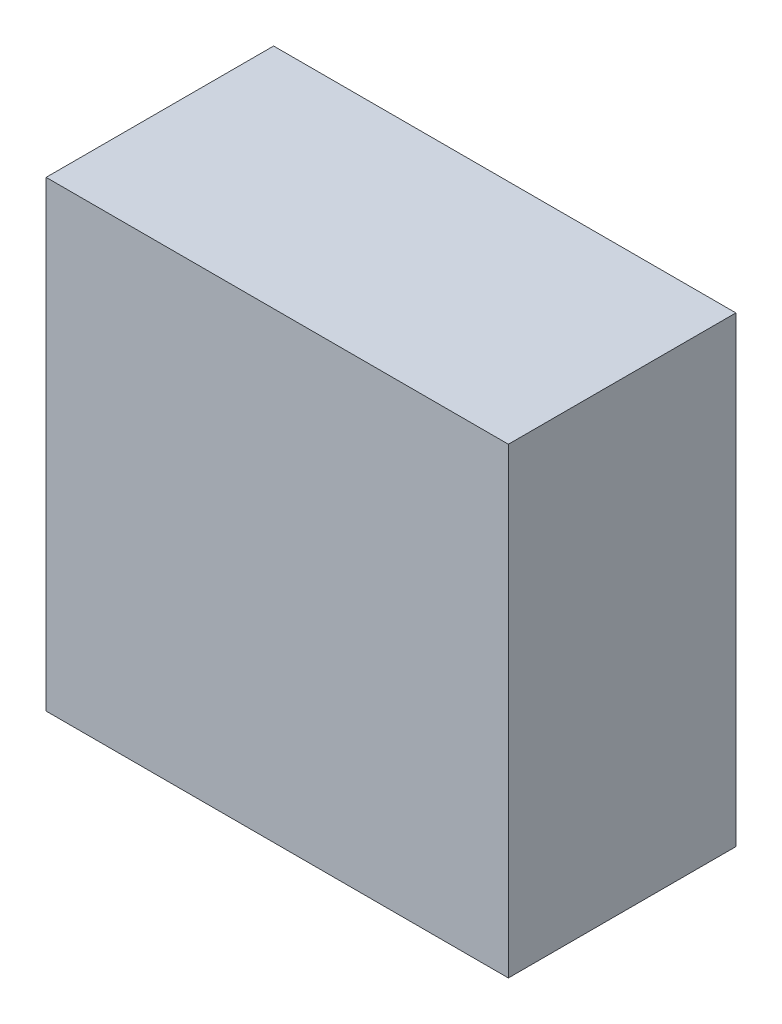
ISO-10303-21;
HEADER;
FILE_DESCRIPTION(('STEP AP214'),'2;1');
FILE_NAME('part.step','',(''),(''),'','','');
FILE_SCHEMA(('AUTOMOTIVE_DESIGN { 1 0 10303 214 1 1 1 1 }'));
ENDSEC;
DATA;
#1=APPLICATION_CONTEXT('core data for automotive mechanical design processes');
#2=APPLICATION_PROTOCOL_DEFINITION('international standard','automotive_design',2000,#1);
#3=PRODUCT_CONTEXT('',#1,'mechanical');
#4=PRODUCT('Part','Part','',(#3));
#5=PRODUCT_RELATED_PRODUCT_CATEGORY('part','',(#4));
#6=PRODUCT_DEFINITION_FORMATION('','',#4);
#7=PRODUCT_DEFINITION_CONTEXT('part definition',#1,'design');
#8=PRODUCT_DEFINITION('design','',#6,#7);
#9=PRODUCT_DEFINITION_SHAPE('','',#8);
#10=(LENGTH_UNIT() NAMED_UNIT(*) SI_UNIT(.MILLI.,.METRE.));
#11=(NAMED_UNIT(*) PLANE_ANGLE_UNIT() SI_UNIT($,.RADIAN.));
#12=(NAMED_UNIT(*) SI_UNIT($,.STERADIAN.) SOLID_ANGLE_UNIT());
#13=UNCERTAINTY_MEASURE_WITH_UNIT(LENGTH_MEASURE(1.E-05),#10,'distance_accuracy_value','');
#14=(GEOMETRIC_REPRESENTATION_CONTEXT(3) GLOBAL_UNCERTAINTY_ASSIGNED_CONTEXT((#13)) GLOBAL_UNIT_ASSIGNED_CONTEXT((#10,
#11,#12)) REPRESENTATION_CONTEXT('',''));
#15=CARTESIAN_POINT('',(0.,0.,0.));
#16=DIRECTION('',(0.,0.,1.));
#17=DIRECTION('',(1.,0.,0.));
#18=AXIS2_PLACEMENT_3D('',#15,#16,#17);
#19=CARTESIAN_POINT('',(91.87711950681,14.91241736178,-10.15));
#20=DIRECTION('',(0.,-1.,0.));
#21=DIRECTION('',(0.,0.,-1.));
#22=AXIS2_PLACEMENT_3D('',#19,#20,#21);
#23=PLANE('',#22);
#24=DIRECTION('',(-1.,0.,0.));
#25=VECTOR('',#24,1.);
#26=CARTESIAN_POINT('',(91.87711950681,14.91241736178,-7.65));
#27=LINE('',#26,#25);
#28=CARTESIAN_POINT('',(91.87711950681,14.91241736178,-7.65));
#29=VERTEX_POINT('',#28);
#30=CARTESIAN_POINT('',(86.79711950681,14.91241736178,-7.65));
#31=VERTEX_POINT('',#30);
#32=EDGE_CURVE('E11',#29,#31,#27,.T.);
#33=ORIENTED_EDGE('',*,*,#32,.T.);
#34=DIRECTION('',(0.,0.,-1.));
#35=VECTOR('',#34,1.);
#36=CARTESIAN_POINT('',(86.79711950681,14.91241736178,-7.65));
#37=LINE('',#36,#35);
#38=CARTESIAN_POINT('',(86.79711950681,14.91241736178,-10.15));
#39=VERTEX_POINT('',#38);
#40=EDGE_CURVE('E27',#31,#39,#37,.T.);
#41=ORIENTED_EDGE('',*,*,#40,.T.);
#42=DIRECTION('',(-1.,0.,0.));
#43=VECTOR('',#42,1.);
#44=CARTESIAN_POINT('',(91.87711950681,14.91241736178,-10.15));
#45=LINE('',#44,#43);
#46=CARTESIAN_POINT('',(91.87711950681,14.91241736178,-10.15));
#47=VERTEX_POINT('',#46);
#48=EDGE_CURVE('E82',#47,#39,#45,.T.);
#49=ORIENTED_EDGE('',*,*,#48,.F.);
#50=DIRECTION('',(0.,0.,-1.));
#51=VECTOR('',#50,1.);
#52=CARTESIAN_POINT('',(91.87711950681,14.91241736178,-7.65));
#53=LINE('',#52,#51);
#54=EDGE_CURVE('E79',#29,#47,#53,.T.);
#55=ORIENTED_EDGE('',*,*,#54,.F.);
#56=EDGE_LOOP('',(#33,#41,#49,#55));
#57=FACE_BOUND('',#56,.T.);
#58=ADVANCED_FACE('F17',(#57),#23,.T.);
#59=CARTESIAN_POINT('',(91.87711950681,19.99241736178,-10.15));
#60=DIRECTION('',(1.,0.,0.));
#61=DIRECTION('',(0.,0.,-1.));
#62=AXIS2_PLACEMENT_3D('',#59,#60,#61);
#63=PLANE('',#62);
#64=DIRECTION('',(0.,-1.,0.));
#65=VECTOR('',#64,1.);
#66=CARTESIAN_POINT('',(91.87711950681,19.99241736178,-7.65));
#67=LINE('',#66,#65);
#68=CARTESIAN_POINT('',(91.87711950681,19.99241736178,-7.65));
#69=VERTEX_POINT('',#68);
#70=EDGE_CURVE('E71',#69,#29,#67,.T.);
#71=ORIENTED_EDGE('',*,*,#70,.T.);
#72=ORIENTED_EDGE('',*,*,#54,.T.);
#73=DIRECTION('',(0.,-1.,0.));
#74=VECTOR('',#73,1.);
#75=CARTESIAN_POINT('',(91.87711950681,19.99241736178,-10.15));
#76=LINE('',#75,#74);
#77=CARTESIAN_POINT('',(91.87711950681,19.99241736178,-10.15));
#78=VERTEX_POINT('',#77);
#79=EDGE_CURVE('E77',#78,#47,#76,.T.);
#80=ORIENTED_EDGE('',*,*,#79,.F.);
#81=DIRECTION('',(0.,0.,-1.));
#82=VECTOR('',#81,1.);
#83=CARTESIAN_POINT('',(91.87711950681,19.99241736178,-7.65));
#84=LINE('',#83,#82);
#85=EDGE_CURVE('E72',#69,#78,#84,.T.);
#86=ORIENTED_EDGE('',*,*,#85,.F.);
#87=EDGE_LOOP('',(#71,#72,#80,#86));
#88=FACE_BOUND('',#87,.T.);
#89=ADVANCED_FACE('F91',(#88),#63,.T.);
#90=CARTESIAN_POINT('',(86.79711950681,19.99241736178,-10.15));
#91=DIRECTION('',(0.,1.,0.));
#92=DIRECTION('',(0.,0.,1.));
#93=AXIS2_PLACEMENT_3D('',#90,#91,#92);
#94=PLANE('',#93);
#95=ORIENTED_EDGE('',*,*,#85,.T.);
#96=DIRECTION('',(1.,0.,0.));
#97=VECTOR('',#96,1.);
#98=CARTESIAN_POINT('',(86.79711950681,19.99241736178,-10.15));
#99=LINE('',#98,#97);
#100=CARTESIAN_POINT('',(86.79711950681,19.99241736178,-10.15));
#101=VERTEX_POINT('',#100);
#102=EDGE_CURVE('E55',#101,#78,#99,.T.);
#103=ORIENTED_EDGE('',*,*,#102,.F.);
#104=DIRECTION('',(0.,0.,-1.));
#105=VECTOR('',#104,1.);
#106=CARTESIAN_POINT('',(86.79711950681,19.99241736178,-7.65));
#107=LINE('',#106,#105);
#108=CARTESIAN_POINT('',(86.79711950681,19.99241736178,-7.65));
#109=VERTEX_POINT('',#108);
#110=EDGE_CURVE('E58',#109,#101,#107,.T.);
#111=ORIENTED_EDGE('',*,*,#110,.F.);
#112=DIRECTION('',(1.,0.,0.));
#113=VECTOR('',#112,1.);
#114=CARTESIAN_POINT('',(86.79711950681,19.99241736178,-7.65));
#115=LINE('',#114,#113);
#116=EDGE_CURVE('E61',#109,#69,#115,.T.);
#117=ORIENTED_EDGE('',*,*,#116,.T.);
#118=EDGE_LOOP('',(#95,#103,#111,#117));
#119=FACE_BOUND('',#118,.T.);
#120=ADVANCED_FACE('F60',(#119),#94,.T.);
#121=CARTESIAN_POINT('',(28.92902687939,21.21360244551,-7.65));
#122=DIRECTION('',(0.,0.,1.));
#123=DIRECTION('',(1.,0.,0.));
#124=AXIS2_PLACEMENT_3D('',#121,#122,#123);
#125=PLANE('',#124);
#126=ORIENTED_EDGE('',*,*,#32,.F.);
#127=ORIENTED_EDGE('',*,*,#70,.F.);
#128=ORIENTED_EDGE('',*,*,#116,.F.);
#129=DIRECTION('',(0.,1.,0.));
#130=VECTOR('',#129,1.);
#131=CARTESIAN_POINT('',(86.79711950681,14.91241736178,-7.65));
#132=LINE('',#131,#130);
#133=EDGE_CURVE('E63',#31,#109,#132,.T.);
#134=ORIENTED_EDGE('',*,*,#133,.F.);
#135=EDGE_LOOP('',(#126,#127,#128,#134));
#136=FACE_BOUND('',#135,.T.);
#137=ADVANCED_FACE('F69',(#136),#125,.T.);
#138=CARTESIAN_POINT('',(86.79711950681,14.91241736178,-10.15));
#139=DIRECTION('',(-1.,0.,0.));
#140=DIRECTION('',(0.,0.,1.));
#141=AXIS2_PLACEMENT_3D('',#138,#139,#140);
#142=PLANE('',#141);
#143=ORIENTED_EDGE('',*,*,#133,.T.);
#144=ORIENTED_EDGE('',*,*,#110,.T.);
#145=DIRECTION('',(0.,1.,0.));
#146=VECTOR('',#145,1.);
#147=CARTESIAN_POINT('',(86.79711950681,14.91241736178,-10.15));
#148=LINE('',#147,#146);
#149=EDGE_CURVE('E21',#39,#101,#148,.T.);
#150=ORIENTED_EDGE('',*,*,#149,.F.);
#151=ORIENTED_EDGE('',*,*,#40,.F.);
#152=EDGE_LOOP('',(#143,#144,#150,#151));
#153=FACE_BOUND('',#152,.T.);
#154=ADVANCED_FACE('F74',(#153),#142,.T.);
#155=CARTESIAN_POINT('',(28.92902687939,21.21360244551,-10.15));
#156=DIRECTION('',(0.,0.,1.));
#157=DIRECTION('',(1.,0.,0.));
#158=AXIS2_PLACEMENT_3D('',#155,#156,#157);
#159=PLANE('',#158);
#160=ORIENTED_EDGE('',*,*,#102,.T.);
#161=ORIENTED_EDGE('',*,*,#79,.T.);
#162=ORIENTED_EDGE('',*,*,#48,.T.);
#163=ORIENTED_EDGE('',*,*,#149,.T.);
#164=EDGE_LOOP('',(#160,#161,#162,#163));
#165=FACE_BOUND('',#164,.T.);
#166=ADVANCED_FACE('F19',(#165),#159,.F.);
#167=CLOSED_SHELL('',(#58,#89,#120,#137,#154,#166));
#168=MANIFOLD_SOLID_BREP('B1',#167);
#169=ADVANCED_BREP_SHAPE_REPRESENTATION('',(#18,#168),#14);
#170=SHAPE_DEFINITION_REPRESENTATION(#9,#169);
ENDSEC;
END-ISO-10303-21;
